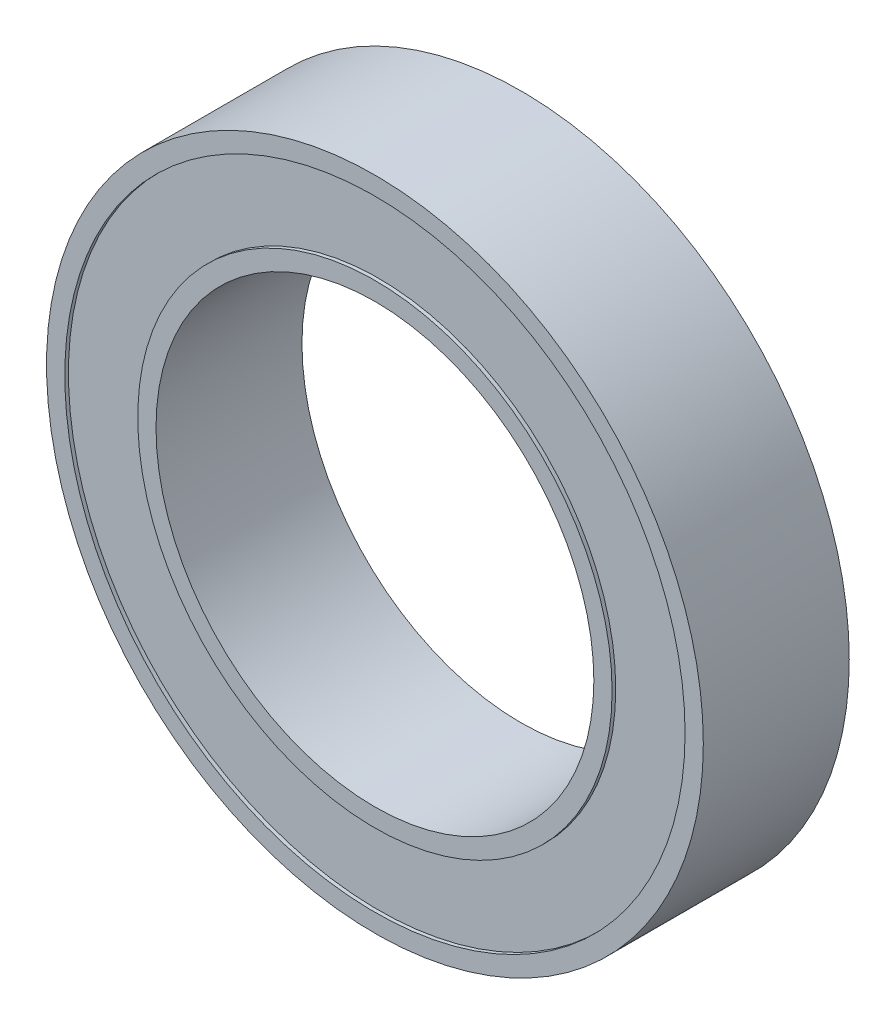
ISO-10303-21;
HEADER;
FILE_DESCRIPTION(('STEP AP214'),'2;1');
FILE_NAME('part.step','',(''),(''),'','','');
FILE_SCHEMA(('AUTOMOTIVE_DESIGN { 1 0 10303 214 1 1 1 1 }'));
ENDSEC;
DATA;
#1=APPLICATION_CONTEXT('core data for automotive mechanical design processes');
#2=APPLICATION_PROTOCOL_DEFINITION('international standard','automotive_design',2000,#1);
#3=PRODUCT_CONTEXT('',#1,'mechanical');
#4=PRODUCT('Part','Part','',(#3));
#5=PRODUCT_RELATED_PRODUCT_CATEGORY('part','',(#4));
#6=PRODUCT_DEFINITION_FORMATION('','',#4);
#7=PRODUCT_DEFINITION_CONTEXT('part definition',#1,'design');
#8=PRODUCT_DEFINITION('design','',#6,#7);
#9=PRODUCT_DEFINITION_SHAPE('','',#8);
#10=(LENGTH_UNIT() NAMED_UNIT(*) SI_UNIT(.MILLI.,.METRE.));
#11=(NAMED_UNIT(*) PLANE_ANGLE_UNIT() SI_UNIT($,.RADIAN.));
#12=(NAMED_UNIT(*) SI_UNIT($,.STERADIAN.) SOLID_ANGLE_UNIT());
#13=UNCERTAINTY_MEASURE_WITH_UNIT(LENGTH_MEASURE(1.E-05),#10,'distance_accuracy_value','');
#14=(GEOMETRIC_REPRESENTATION_CONTEXT(3) GLOBAL_UNCERTAINTY_ASSIGNED_CONTEXT((#13)) GLOBAL_UNIT_ASSIGNED_CONTEXT((#10,
#11,#12)) REPRESENTATION_CONTEXT('',''));
#15=CARTESIAN_POINT('',(0.,0.,0.));
#16=DIRECTION('',(0.,0.,1.));
#17=DIRECTION('',(1.,0.,0.));
#18=AXIS2_PLACEMENT_3D('',#15,#16,#17);
#19=CARTESIAN_POINT('',(0.,0.,4.));
#20=DIRECTION('',(0.,0.,1.));
#21=DIRECTION('',(1.,0.,0.));
#22=AXIS2_PLACEMENT_3D('',#19,#20,#21);
#23=PLANE('',#22);
#24=CARTESIAN_POINT('',(0.,0.,4.));
#25=DIRECTION('',(0.,0.,1.));
#26=DIRECTION('',(1.,0.,0.));
#27=AXIS2_PLACEMENT_3D('',#24,#25,#26);
#28=CIRCLE('',#27,6.);
#29=CARTESIAN_POINT('',(6.,0.,4.));
#30=VERTEX_POINT('',#29);
#31=EDGE_CURVE('E47',#30,#30,#28,.T.);
#32=ORIENTED_EDGE('',*,*,#31,.F.);
#33=EDGE_LOOP('',(#32));
#34=FACE_BOUND('',#33,.T.);
#35=CARTESIAN_POINT('',(0.,0.,4.));
#36=DIRECTION('',(0.,0.,1.));
#37=DIRECTION('',(1.,0.,0.));
#38=AXIS2_PLACEMENT_3D('',#35,#36,#37);
#39=CIRCLE('',#38,6.5);
#40=CARTESIAN_POINT('',(6.5,0.,4.));
#41=VERTEX_POINT('',#40);
#42=EDGE_CURVE('E73',#41,#41,#39,.T.);
#43=ORIENTED_EDGE('',*,*,#42,.T.);
#44=EDGE_LOOP('',(#43));
#45=FACE_BOUND('',#44,.T.);
#46=ADVANCED_FACE('F36',(#34,#45),#23,.T.);
#47=CARTESIAN_POINT('',(0.,0.,0.));
#48=DIRECTION('',(0.,0.,1.));
#49=DIRECTION('',(1.,0.,0.));
#50=AXIS2_PLACEMENT_3D('',#47,#48,#49);
#51=PLANE('',#50);
#52=CARTESIAN_POINT('',(0.,0.,0.));
#53=DIRECTION('',(0.,0.,1.));
#54=DIRECTION('',(1.,0.,0.));
#55=AXIS2_PLACEMENT_3D('',#52,#53,#54);
#56=CIRCLE('',#55,6.);
#57=CARTESIAN_POINT('',(6.,0.,0.));
#58=VERTEX_POINT('',#57);
#59=EDGE_CURVE('E49',#58,#58,#56,.T.);
#60=ORIENTED_EDGE('',*,*,#59,.T.);
#61=EDGE_LOOP('',(#60));
#62=FACE_BOUND('',#61,.T.);
#63=CARTESIAN_POINT('',(0.,0.,0.));
#64=DIRECTION('',(0.,0.,-1.));
#65=DIRECTION('',(-1.,0.,0.));
#66=AXIS2_PLACEMENT_3D('',#63,#64,#65);
#67=CIRCLE('',#66,6.5);
#68=CARTESIAN_POINT('',(-6.5,0.,0.));
#69=VERTEX_POINT('',#68);
#70=EDGE_CURVE('E61',#69,#69,#67,.T.);
#71=ORIENTED_EDGE('',*,*,#70,.T.);
#72=EDGE_LOOP('',(#71));
#73=FACE_BOUND('',#72,.T.);
#74=ADVANCED_FACE('F98',(#62,#73),#51,.F.);
#75=CARTESIAN_POINT('',(0.,0.,4.));
#76=DIRECTION('',(0.,0.,1.));
#77=DIRECTION('',(1.,0.,0.));
#78=AXIS2_PLACEMENT_3D('',#75,#76,#77);
#79=CIRCLE('',#78,8.5);
#80=CARTESIAN_POINT('',(8.5,0.,4.));
#81=VERTEX_POINT('',#80);
#82=EDGE_CURVE('E67',#81,#81,#79,.T.);
#83=ORIENTED_EDGE('',*,*,#82,.F.);
#84=EDGE_LOOP('',(#83));
#85=FACE_BOUND('',#84,.T.);
#86=CARTESIAN_POINT('',(0.,0.,4.));
#87=DIRECTION('',(0.,0.,1.));
#88=DIRECTION('',(1.,0.,0.));
#89=AXIS2_PLACEMENT_3D('',#86,#87,#88);
#90=CIRCLE('',#89,9.);
#91=CARTESIAN_POINT('',(9.,0.,4.));
#92=VERTEX_POINT('',#91);
#93=EDGE_CURVE('E10',#92,#92,#90,.T.);
#94=ORIENTED_EDGE('',*,*,#93,.T.);
#95=EDGE_LOOP('',(#94));
#96=FACE_BOUND('',#95,.T.);
#97=ADVANCED_FACE('F95',(#85,#96),#23,.T.);
#98=CARTESIAN_POINT('',(0.,0.,0.));
#99=DIRECTION('',(0.,0.,-1.));
#100=DIRECTION('',(-1.,0.,0.));
#101=AXIS2_PLACEMENT_3D('',#98,#99,#100);
#102=CIRCLE('',#101,8.5);
#103=CARTESIAN_POINT('',(-8.5,0.,0.));
#104=VERTEX_POINT('',#103);
#105=EDGE_CURVE('E55',#104,#104,#102,.T.);
#106=ORIENTED_EDGE('',*,*,#105,.F.);
#107=EDGE_LOOP('',(#106));
#108=FACE_BOUND('',#107,.T.);
#109=CARTESIAN_POINT('',(0.,0.,0.));
#110=DIRECTION('',(0.,0.,1.));
#111=DIRECTION('',(1.,0.,0.));
#112=AXIS2_PLACEMENT_3D('',#109,#110,#111);
#113=CIRCLE('',#112,9.);
#114=CARTESIAN_POINT('',(9.,0.,0.));
#115=VERTEX_POINT('',#114);
#116=EDGE_CURVE('E40',#115,#115,#113,.T.);
#117=ORIENTED_EDGE('',*,*,#116,.F.);
#118=EDGE_LOOP('',(#117));
#119=FACE_BOUND('',#118,.T.);
#120=ADVANCED_FACE('F97',(#108,#119),#51,.F.);
#121=CARTESIAN_POINT('',(0.,0.,4.));
#122=DIRECTION('',(0.,0.,-1.));
#123=DIRECTION('',(-1.,0.,0.));
#124=AXIS2_PLACEMENT_3D('',#121,#122,#123);
#125=CYLINDRICAL_SURFACE('',#124,9.);
#126=ORIENTED_EDGE('',*,*,#93,.F.);
#127=EDGE_LOOP('',(#126));
#128=FACE_BOUND('',#127,.T.);
#129=ORIENTED_EDGE('',*,*,#116,.T.);
#130=EDGE_LOOP('',(#129));
#131=FACE_BOUND('',#130,.T.);
#132=ADVANCED_FACE('F38',(#128,#131),#125,.T.);
#133=CARTESIAN_POINT('',(0.,0.,4.));
#134=DIRECTION('',(0.,0.,-1.));
#135=DIRECTION('',(-1.,0.,0.));
#136=AXIS2_PLACEMENT_3D('',#133,#134,#135);
#137=CYLINDRICAL_SURFACE('',#136,6.);
#138=ORIENTED_EDGE('',*,*,#31,.T.);
#139=EDGE_LOOP('',(#138));
#140=FACE_BOUND('',#139,.T.);
#141=ORIENTED_EDGE('',*,*,#59,.F.);
#142=EDGE_LOOP('',(#141));
#143=FACE_BOUND('',#142,.T.);
#144=ADVANCED_FACE('F128',(#140,#143),#137,.F.);
#145=CARTESIAN_POINT('',(0.,0.,0.1));
#146=DIRECTION('',(0.,0.,-1.));
#147=DIRECTION('',(-1.,0.,0.));
#148=AXIS2_PLACEMENT_3D('',#145,#146,#147);
#149=CYLINDRICAL_SURFACE('',#148,8.5);
#150=CARTESIAN_POINT('',(0.,0.,0.1));
#151=DIRECTION('',(0.,0.,-1.));
#152=DIRECTION('',(-1.,0.,0.));
#153=AXIS2_PLACEMENT_3D('',#150,#151,#152);
#154=CIRCLE('',#153,8.5);
#155=CARTESIAN_POINT('',(-8.5,0.,0.1));
#156=VERTEX_POINT('',#155);
#157=EDGE_CURVE('E52',#156,#156,#154,.T.);
#158=ORIENTED_EDGE('',*,*,#157,.F.);
#159=EDGE_LOOP('',(#158));
#160=FACE_BOUND('',#159,.T.);
#161=ORIENTED_EDGE('',*,*,#105,.T.);
#162=EDGE_LOOP('',(#161));
#163=FACE_BOUND('',#162,.T.);
#164=ADVANCED_FACE('F125',(#160,#163),#149,.F.);
#165=CARTESIAN_POINT('',(0.,0.,0.1));
#166=DIRECTION('',(0.,0.,-1.));
#167=DIRECTION('',(-1.,0.,0.));
#168=AXIS2_PLACEMENT_3D('',#165,#166,#167);
#169=PLANE('',#168);
#170=CARTESIAN_POINT('',(0.,0.,0.1));
#171=DIRECTION('',(0.,0.,-1.));
#172=DIRECTION('',(-1.,0.,0.));
#173=AXIS2_PLACEMENT_3D('',#170,#171,#172);
#174=CIRCLE('',#173,6.5);
#175=CARTESIAN_POINT('',(-6.5,0.,0.1));
#176=VERTEX_POINT('',#175);
#177=EDGE_CURVE('E58',#176,#176,#174,.T.);
#178=ORIENTED_EDGE('',*,*,#177,.F.);
#179=EDGE_LOOP('',(#178));
#180=FACE_BOUND('',#179,.T.);
#181=ORIENTED_EDGE('',*,*,#157,.T.);
#182=EDGE_LOOP('',(#181));
#183=FACE_BOUND('',#182,.T.);
#184=ADVANCED_FACE('F121',(#180,#183),#169,.T.);
#185=CARTESIAN_POINT('',(0.,0.,0.1));
#186=DIRECTION('',(0.,0.,-1.));
#187=DIRECTION('',(-1.,0.,0.));
#188=AXIS2_PLACEMENT_3D('',#185,#186,#187);
#189=CYLINDRICAL_SURFACE('',#188,6.5);
#190=ORIENTED_EDGE('',*,*,#177,.T.);
#191=EDGE_LOOP('',(#190));
#192=FACE_BOUND('',#191,.T.);
#193=ORIENTED_EDGE('',*,*,#70,.F.);
#194=EDGE_LOOP('',(#193));
#195=FACE_BOUND('',#194,.T.);
#196=ADVANCED_FACE('F91',(#192,#195),#189,.T.);
#197=CARTESIAN_POINT('',(0.,0.,3.9));
#198=DIRECTION('',(0.,0.,1.));
#199=DIRECTION('',(1.,0.,0.));
#200=AXIS2_PLACEMENT_3D('',#197,#198,#199);
#201=CYLINDRICAL_SURFACE('',#200,8.5);
#202=CARTESIAN_POINT('',(0.,0.,3.9));
#203=DIRECTION('',(0.,0.,1.));
#204=DIRECTION('',(1.,0.,0.));
#205=AXIS2_PLACEMENT_3D('',#202,#203,#204);
#206=CIRCLE('',#205,8.5);
#207=CARTESIAN_POINT('',(8.5,0.,3.9));
#208=VERTEX_POINT('',#207);
#209=EDGE_CURVE('E64',#208,#208,#206,.T.);
#210=ORIENTED_EDGE('',*,*,#209,.F.);
#211=EDGE_LOOP('',(#210));
#212=FACE_BOUND('',#211,.T.);
#213=ORIENTED_EDGE('',*,*,#82,.T.);
#214=EDGE_LOOP('',(#213));
#215=FACE_BOUND('',#214,.T.);
#216=ADVANCED_FACE('F85',(#212,#215),#201,.F.);
#217=CARTESIAN_POINT('',(0.,0.,3.9));
#218=DIRECTION('',(0.,0.,1.));
#219=DIRECTION('',(1.,0.,0.));
#220=AXIS2_PLACEMENT_3D('',#217,#218,#219);
#221=PLANE('',#220);
#222=CARTESIAN_POINT('',(0.,0.,3.9));
#223=DIRECTION('',(0.,0.,1.));
#224=DIRECTION('',(1.,0.,0.));
#225=AXIS2_PLACEMENT_3D('',#222,#223,#224);
#226=CIRCLE('',#225,6.5);
#227=CARTESIAN_POINT('',(6.5,0.,3.9));
#228=VERTEX_POINT('',#227);
#229=EDGE_CURVE('E70',#228,#228,#226,.T.);
#230=ORIENTED_EDGE('',*,*,#229,.F.);
#231=EDGE_LOOP('',(#230));
#232=FACE_BOUND('',#231,.T.);
#233=ORIENTED_EDGE('',*,*,#209,.T.);
#234=EDGE_LOOP('',(#233));
#235=FACE_BOUND('',#234,.T.);
#236=ADVANCED_FACE('F82',(#232,#235),#221,.T.);
#237=CARTESIAN_POINT('',(0.,0.,3.9));
#238=DIRECTION('',(0.,0.,1.));
#239=DIRECTION('',(1.,0.,0.));
#240=AXIS2_PLACEMENT_3D('',#237,#238,#239);
#241=CYLINDRICAL_SURFACE('',#240,6.5);
#242=ORIENTED_EDGE('',*,*,#229,.T.);
#243=EDGE_LOOP('',(#242));
#244=FACE_BOUND('',#243,.T.);
#245=ORIENTED_EDGE('',*,*,#42,.F.);
#246=EDGE_LOOP('',(#245));
#247=FACE_BOUND('',#246,.T.);
#248=ADVANCED_FACE('F79',(#244,#247),#241,.T.);
#249=CLOSED_SHELL('',(#46,#74,#97,#120,#132,#144,#164,#184,#196,#216,#236,#248));
#250=MANIFOLD_SOLID_BREP('B2',#249);
#251=ADVANCED_BREP_SHAPE_REPRESENTATION('',(#18,#250),#14);
#252=SHAPE_DEFINITION_REPRESENTATION(#9,#251);
ENDSEC;
END-ISO-10303-21;
